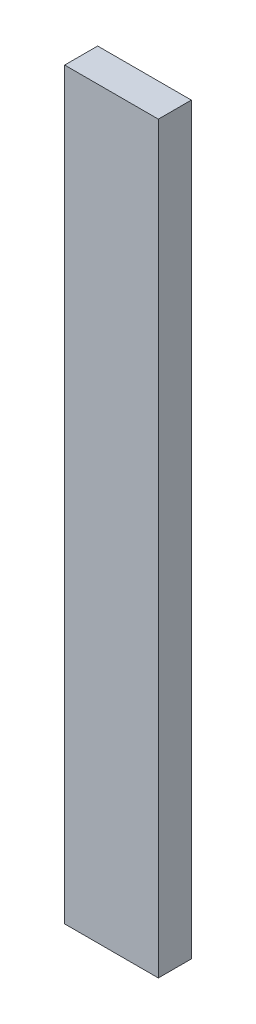
ISO-10303-21;
HEADER;
FILE_DESCRIPTION(('STEP AP214'),'2;1');
FILE_NAME('part.step','',(''),(''),'','','');
FILE_SCHEMA(('AUTOMOTIVE_DESIGN { 1 0 10303 214 1 1 1 1 }'));
ENDSEC;
DATA;
#1=APPLICATION_CONTEXT('core data for automotive mechanical design processes');
#2=APPLICATION_PROTOCOL_DEFINITION('international standard','automotive_design',2000,#1);
#3=PRODUCT_CONTEXT('',#1,'mechanical');
#4=PRODUCT('Part','Part','',(#3));
#5=PRODUCT_RELATED_PRODUCT_CATEGORY('part','',(#4));
#6=PRODUCT_DEFINITION_FORMATION('','',#4);
#7=PRODUCT_DEFINITION_CONTEXT('part definition',#1,'design');
#8=PRODUCT_DEFINITION('design','',#6,#7);
#9=PRODUCT_DEFINITION_SHAPE('','',#8);
#10=(LENGTH_UNIT() NAMED_UNIT(*) SI_UNIT(.MILLI.,.METRE.));
#11=(NAMED_UNIT(*) PLANE_ANGLE_UNIT() SI_UNIT($,.RADIAN.));
#12=(NAMED_UNIT(*) SI_UNIT($,.STERADIAN.) SOLID_ANGLE_UNIT());
#13=UNCERTAINTY_MEASURE_WITH_UNIT(LENGTH_MEASURE(1.E-05),#10,'distance_accuracy_value','');
#14=(GEOMETRIC_REPRESENTATION_CONTEXT(3) GLOBAL_UNCERTAINTY_ASSIGNED_CONTEXT((#13)) GLOBAL_UNIT_ASSIGNED_CONTEXT((#10,
#11,#12)) REPRESENTATION_CONTEXT('',''));
#15=CARTESIAN_POINT('',(0.,0.,0.));
#16=DIRECTION('',(0.,0.,1.));
#17=DIRECTION('',(1.,0.,0.));
#18=AXIS2_PLACEMENT_3D('',#15,#16,#17);
#19=CARTESIAN_POINT('',(1.42,-11.265,1.));
#20=DIRECTION('',(0.,0.,1.));
#21=DIRECTION('',(1.,0.,0.));
#22=AXIS2_PLACEMENT_3D('',#19,#20,#21);
#23=PLANE('',#22);
#24=DIRECTION('',(0.,-1.,0.));
#25=VECTOR('',#24,1.);
#26=CARTESIAN_POINT('',(0.,0.01,1.));
#27=LINE('',#26,#25);
#28=CARTESIAN_POINT('',(0.,0.01,1.));
#29=VERTEX_POINT('',#28);
#30=CARTESIAN_POINT('',(0.,-22.54,1.));
#31=VERTEX_POINT('',#30);
#32=EDGE_CURVE('E20',#29,#31,#27,.T.);
#33=ORIENTED_EDGE('',*,*,#32,.T.);
#34=DIRECTION('',(1.,0.,0.));
#35=VECTOR('',#34,1.);
#36=CARTESIAN_POINT('',(0.,-22.54,1.));
#37=LINE('',#36,#35);
#38=CARTESIAN_POINT('',(2.84,-22.54,1.));
#39=VERTEX_POINT('',#38);
#40=EDGE_CURVE('E83',#31,#39,#37,.T.);
#41=ORIENTED_EDGE('',*,*,#40,.T.);
#42=DIRECTION('',(0.,1.,0.));
#43=VECTOR('',#42,1.);
#44=CARTESIAN_POINT('',(2.84,-22.54,1.));
#45=LINE('',#44,#43);
#46=CARTESIAN_POINT('',(2.84,0.01,1.));
#47=VERTEX_POINT('',#46);
#48=EDGE_CURVE('E103',#39,#47,#45,.T.);
#49=ORIENTED_EDGE('',*,*,#48,.T.);
#50=DIRECTION('',(-1.,0.,0.));
#51=VECTOR('',#50,1.);
#52=CARTESIAN_POINT('',(2.84,0.01,1.));
#53=LINE('',#52,#51);
#54=EDGE_CURVE('E11',#47,#29,#53,.T.);
#55=ORIENTED_EDGE('',*,*,#54,.T.);
#56=EDGE_LOOP('',(#33,#41,#49,#55));
#57=FACE_BOUND('',#56,.T.);
#58=ADVANCED_FACE('F16',(#57),#23,.T.);
#59=CARTESIAN_POINT('',(1.42,-11.265,0.));
#60=DIRECTION('',(0.,0.,1.));
#61=DIRECTION('',(1.,0.,0.));
#62=AXIS2_PLACEMENT_3D('',#59,#60,#61);
#63=PLANE('',#62);
#64=DIRECTION('',(0.,-1.,0.));
#65=VECTOR('',#64,1.);
#66=CARTESIAN_POINT('',(0.,0.01,0.));
#67=LINE('',#66,#65);
#68=CARTESIAN_POINT('',(0.,0.01,0.));
#69=VERTEX_POINT('',#68);
#70=CARTESIAN_POINT('',(0.,-22.54,0.));
#71=VERTEX_POINT('',#70);
#72=EDGE_CURVE('E69',#69,#71,#67,.T.);
#73=ORIENTED_EDGE('',*,*,#72,.F.);
#74=DIRECTION('',(-1.,0.,0.));
#75=VECTOR('',#74,1.);
#76=CARTESIAN_POINT('',(2.84,0.01,0.));
#77=LINE('',#76,#75);
#78=CARTESIAN_POINT('',(2.84,0.01,0.));
#79=VERTEX_POINT('',#78);
#80=EDGE_CURVE('E27',#79,#69,#77,.T.);
#81=ORIENTED_EDGE('',*,*,#80,.F.);
#82=DIRECTION('',(0.,1.,0.));
#83=VECTOR('',#82,1.);
#84=CARTESIAN_POINT('',(2.84,-22.54,0.));
#85=LINE('',#84,#83);
#86=CARTESIAN_POINT('',(2.84,-22.54,0.));
#87=VERTEX_POINT('',#86);
#88=EDGE_CURVE('E72',#87,#79,#85,.T.);
#89=ORIENTED_EDGE('',*,*,#88,.F.);
#90=DIRECTION('',(1.,0.,0.));
#91=VECTOR('',#90,1.);
#92=CARTESIAN_POINT('',(0.,-22.54,0.));
#93=LINE('',#92,#91);
#94=EDGE_CURVE('E66',#71,#87,#93,.T.);
#95=ORIENTED_EDGE('',*,*,#94,.F.);
#96=EDGE_LOOP('',(#73,#81,#89,#95));
#97=FACE_BOUND('',#96,.T.);
#98=ADVANCED_FACE('F18',(#97),#63,.F.);
#99=CARTESIAN_POINT('',(2.84,0.01,0.));
#100=DIRECTION('',(0.,-1.,0.));
#101=DIRECTION('',(0.,0.,-1.));
#102=AXIS2_PLACEMENT_3D('',#99,#100,#101);
#103=PLANE('',#102);
#104=DIRECTION('',(0.,0.,1.));
#105=VECTOR('',#104,1.);
#106=CARTESIAN_POINT('',(2.84,0.01,0.));
#107=LINE('',#106,#105);
#108=EDGE_CURVE('E100',#79,#47,#107,.T.);
#109=ORIENTED_EDGE('',*,*,#108,.F.);
#110=ORIENTED_EDGE('',*,*,#80,.T.);
#111=DIRECTION('',(0.,0.,1.));
#112=VECTOR('',#111,1.);
#113=CARTESIAN_POINT('',(0.,0.01,0.));
#114=LINE('',#113,#112);
#115=EDGE_CURVE('E90',#69,#29,#114,.T.);
#116=ORIENTED_EDGE('',*,*,#115,.T.);
#117=ORIENTED_EDGE('',*,*,#54,.F.);
#118=EDGE_LOOP('',(#109,#110,#116,#117));
#119=FACE_BOUND('',#118,.T.);
#120=ADVANCED_FACE('F120',(#119),#103,.F.);
#121=CARTESIAN_POINT('',(2.84,-22.54,0.));
#122=DIRECTION('',(-1.,0.,0.));
#123=DIRECTION('',(0.,0.,1.));
#124=AXIS2_PLACEMENT_3D('',#121,#122,#123);
#125=PLANE('',#124);
#126=DIRECTION('',(0.,0.,1.));
#127=VECTOR('',#126,1.);
#128=CARTESIAN_POINT('',(2.84,-22.54,0.));
#129=LINE('',#128,#127);
#130=EDGE_CURVE('E77',#87,#39,#129,.T.);
#131=ORIENTED_EDGE('',*,*,#130,.F.);
#132=ORIENTED_EDGE('',*,*,#88,.T.);
#133=ORIENTED_EDGE('',*,*,#108,.T.);
#134=ORIENTED_EDGE('',*,*,#48,.F.);
#135=EDGE_LOOP('',(#131,#132,#133,#134));
#136=FACE_BOUND('',#135,.T.);
#137=ADVANCED_FACE('F118',(#136),#125,.F.);
#138=CARTESIAN_POINT('',(0.,-22.54,0.));
#139=DIRECTION('',(0.,1.,0.));
#140=DIRECTION('',(1.,0.,0.));
#141=AXIS2_PLACEMENT_3D('',#138,#139,#140);
#142=PLANE('',#141);
#143=DIRECTION('',(0.,0.,1.));
#144=VECTOR('',#143,1.);
#145=CARTESIAN_POINT('',(0.,-22.54,0.));
#146=LINE('',#145,#144);
#147=EDGE_CURVE('E80',#71,#31,#146,.T.);
#148=ORIENTED_EDGE('',*,*,#147,.F.);
#149=ORIENTED_EDGE('',*,*,#94,.T.);
#150=ORIENTED_EDGE('',*,*,#130,.T.);
#151=ORIENTED_EDGE('',*,*,#40,.F.);
#152=EDGE_LOOP('',(#148,#149,#150,#151));
#153=FACE_BOUND('',#152,.T.);
#154=ADVANCED_FACE('F81',(#153),#142,.F.);
#155=CARTESIAN_POINT('',(0.,0.01,0.));
#156=DIRECTION('',(1.,0.,0.));
#157=DIRECTION('',(0.,1.,0.));
#158=AXIS2_PLACEMENT_3D('',#155,#156,#157);
#159=PLANE('',#158);
#160=ORIENTED_EDGE('',*,*,#115,.F.);
#161=ORIENTED_EDGE('',*,*,#72,.T.);
#162=ORIENTED_EDGE('',*,*,#147,.T.);
#163=ORIENTED_EDGE('',*,*,#32,.F.);
#164=EDGE_LOOP('',(#160,#161,#162,#163));
#165=FACE_BOUND('',#164,.T.);
#166=ADVANCED_FACE('F89',(#165),#159,.F.);
#167=CLOSED_SHELL('',(#58,#98,#120,#137,#154,#166));
#168=MANIFOLD_SOLID_BREP('B1',#167);
#169=ADVANCED_BREP_SHAPE_REPRESENTATION('',(#18,#168),#14);
#170=SHAPE_DEFINITION_REPRESENTATION(#9,#169);
ENDSEC;
END-ISO-10303-21;
